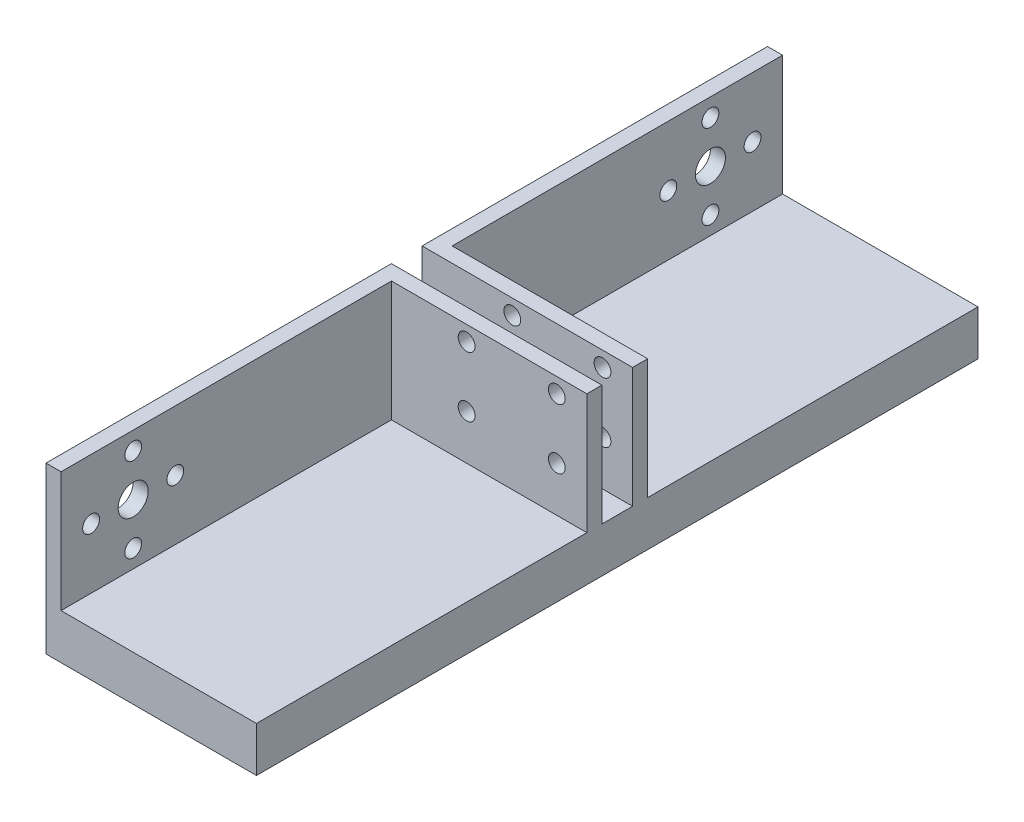
ISO-10303-21;
HEADER;
FILE_DESCRIPTION(('STEP AP214'),'2;1');
FILE_NAME('part.step','',(''),(''),'','','');
FILE_SCHEMA(('AUTOMOTIVE_DESIGN { 1 0 10303 214 1 1 1 1 }'));
ENDSEC;
DATA;
#1=APPLICATION_CONTEXT('core data for automotive mechanical design processes');
#2=APPLICATION_PROTOCOL_DEFINITION('international standard','automotive_design',2000,#1);
#3=PRODUCT_CONTEXT('',#1,'mechanical');
#4=PRODUCT('Part','Part','',(#3));
#5=PRODUCT_RELATED_PRODUCT_CATEGORY('part','',(#4));
#6=PRODUCT_DEFINITION_FORMATION('','',#4);
#7=PRODUCT_DEFINITION_CONTEXT('part definition',#1,'design');
#8=PRODUCT_DEFINITION('design','',#6,#7);
#9=PRODUCT_DEFINITION_SHAPE('','',#8);
#10=(LENGTH_UNIT() NAMED_UNIT(*) SI_UNIT(.MILLI.,.METRE.));
#11=(NAMED_UNIT(*) PLANE_ANGLE_UNIT() SI_UNIT($,.RADIAN.));
#12=(NAMED_UNIT(*) SI_UNIT($,.STERADIAN.) SOLID_ANGLE_UNIT());
#13=UNCERTAINTY_MEASURE_WITH_UNIT(LENGTH_MEASURE(1.E-05),#10,'distance_accuracy_value','');
#14=(GEOMETRIC_REPRESENTATION_CONTEXT(3) GLOBAL_UNCERTAINTY_ASSIGNED_CONTEXT((#13)) GLOBAL_UNIT_ASSIGNED_CONTEXT((#10,
#11,#12)) REPRESENTATION_CONTEXT('',''));
#15=CARTESIAN_POINT('',(0.,0.,0.));
#16=DIRECTION('',(0.,0.,1.));
#17=DIRECTION('',(1.,0.,0.));
#18=AXIS2_PLACEMENT_3D('',#15,#16,#17);
#19=CARTESIAN_POINT('',(0.,7.5,0.));
#20=DIRECTION('',(0.,1.,0.));
#21=DIRECTION('',(0.,0.,1.));
#22=AXIS2_PLACEMENT_3D('',#19,#20,#21);
#23=PLANE('',#22);
#24=DIRECTION('',(0.,0.,1.));
#25=VECTOR('',#24,1.);
#26=CARTESIAN_POINT('',(-32.5,7.5,0.));
#27=LINE('',#26,#25);
#28=CARTESIAN_POINT('',(-32.5,7.5,-60.));
#29=VERTEX_POINT('',#28);
#30=CARTESIAN_POINT('',(-32.5,7.5,-5.04999999999999));
#31=VERTEX_POINT('',#30);
#32=EDGE_CURVE('E179',#29,#31,#27,.T.);
#33=ORIENTED_EDGE('',*,*,#32,.T.);
#34=DIRECTION('',(1.,0.,0.));
#35=VECTOR('',#34,1.);
#36=CARTESIAN_POINT('',(0.,7.5,-5.05000000000001));
#37=LINE('',#36,#35);
#38=CARTESIAN_POINT('',(0.,7.5,-5.05));
#39=VERTEX_POINT('',#38);
#40=EDGE_CURVE('E58',#31,#39,#37,.T.);
#41=ORIENTED_EDGE('',*,*,#40,.T.);
#42=DIRECTION('',(0.,0.,-1.));
#43=VECTOR('',#42,1.);
#44=CARTESIAN_POINT('',(0.,7.5,-60.));
#45=LINE('',#44,#43);
#46=CARTESIAN_POINT('',(0.,7.5,-60.));
#47=VERTEX_POINT('',#46);
#48=EDGE_CURVE('E228',#39,#47,#45,.T.);
#49=ORIENTED_EDGE('',*,*,#48,.T.);
#50=DIRECTION('',(-1.,0.,0.));
#51=VECTOR('',#50,1.);
#52=CARTESIAN_POINT('',(-35.,7.5,-60.));
#53=LINE('',#52,#51);
#54=EDGE_CURVE('E232',#47,#29,#53,.T.);
#55=ORIENTED_EDGE('',*,*,#54,.T.);
#56=EDGE_LOOP('',(#33,#41,#49,#55));
#57=FACE_BOUND('',#56,.T.);
#58=ADVANCED_FACE('F41',(#57),#23,.T.);
#59=CARTESIAN_POINT('',(0.,7.5,60.));
#60=VERTEX_POINT('',#59);
#61=CARTESIAN_POINT('',(0.,7.5,5.05000000000001));
#62=VERTEX_POINT('',#61);
#63=EDGE_CURVE('E229',#60,#62,#45,.T.);
#64=ORIENTED_EDGE('',*,*,#63,.T.);
#65=DIRECTION('',(-1.,0.,0.));
#66=VECTOR('',#65,1.);
#67=CARTESIAN_POINT('',(0.,7.5,5.05000000000001));
#68=LINE('',#67,#66);
#69=CARTESIAN_POINT('',(-32.5,7.5,5.05));
#70=VERTEX_POINT('',#69);
#71=EDGE_CURVE('E194',#62,#70,#68,.T.);
#72=ORIENTED_EDGE('',*,*,#71,.T.);
#73=DIRECTION('',(0.,0.,1.));
#74=VECTOR('',#73,1.);
#75=CARTESIAN_POINT('',(-32.5,7.5,0.));
#76=LINE('',#75,#74);
#77=CARTESIAN_POINT('',(-32.5,7.5,60.));
#78=VERTEX_POINT('',#77);
#79=EDGE_CURVE('E210',#70,#78,#76,.T.);
#80=ORIENTED_EDGE('',*,*,#79,.T.);
#81=DIRECTION('',(1.,0.,0.));
#82=VECTOR('',#81,1.);
#83=CARTESIAN_POINT('',(-35.,7.5,60.));
#84=LINE('',#83,#82);
#85=EDGE_CURVE('E225',#78,#60,#84,.T.);
#86=ORIENTED_EDGE('',*,*,#85,.T.);
#87=EDGE_LOOP('',(#64,#72,#80,#86));
#88=FACE_BOUND('',#87,.T.);
#89=ADVANCED_FACE('F312',(#88),#23,.T.);
#90=CARTESIAN_POINT('',(-35.,7.5,-60.));
#91=DIRECTION('',(1.,0.,0.));
#92=DIRECTION('',(0.,0.,-1.));
#93=AXIS2_PLACEMENT_3D('',#90,#91,#92);
#94=PLANE('',#93);
#95=CARTESIAN_POINT('',(-35.,17.5,41.));
#96=DIRECTION('',(1.,0.,0.));
#97=DIRECTION('',(0.,0.,1.));
#98=AXIS2_PLACEMENT_3D('',#95,#96,#97);
#99=CIRCLE('',#98,1.4);
#100=CARTESIAN_POINT('',(-35.,17.5,42.4));
#101=VERTEX_POINT('',#100);
#102=EDGE_CURVE('E451',#101,#101,#99,.T.);
#103=ORIENTED_EDGE('',*,*,#102,.T.);
#104=EDGE_LOOP('',(#103));
#105=FACE_BOUND('',#104,.T.);
#106=CARTESIAN_POINT('',(-35.,10.5,48.));
#107=DIRECTION('',(1.,0.,0.));
#108=DIRECTION('',(0.,0.,1.));
#109=AXIS2_PLACEMENT_3D('',#106,#107,#108);
#110=CIRCLE('',#109,1.4);
#111=CARTESIAN_POINT('',(-35.,10.5,49.4));
#112=VERTEX_POINT('',#111);
#113=EDGE_CURVE('E481',#112,#112,#110,.T.);
#114=ORIENTED_EDGE('',*,*,#113,.T.);
#115=EDGE_LOOP('',(#114));
#116=FACE_BOUND('',#115,.T.);
#117=CARTESIAN_POINT('',(-35.,17.5,55.));
#118=DIRECTION('',(1.,0.,0.));
#119=DIRECTION('',(0.,0.,-1.));
#120=AXIS2_PLACEMENT_3D('',#117,#118,#119);
#121=CIRCLE('',#120,1.4);
#122=CARTESIAN_POINT('',(-35.,17.5,53.6));
#123=VERTEX_POINT('',#122);
#124=EDGE_CURVE('E464',#123,#123,#121,.T.);
#125=ORIENTED_EDGE('',*,*,#124,.T.);
#126=EDGE_LOOP('',(#125));
#127=FACE_BOUND('',#126,.T.);
#128=CARTESIAN_POINT('',(-35.,24.5,48.));
#129=DIRECTION('',(1.,0.,0.));
#130=DIRECTION('',(0.,0.,-1.));
#131=AXIS2_PLACEMENT_3D('',#128,#129,#130);
#132=CIRCLE('',#131,1.4);
#133=CARTESIAN_POINT('',(-35.,24.5,46.6));
#134=VERTEX_POINT('',#133);
#135=EDGE_CURVE('E471',#134,#134,#132,.T.);
#136=ORIENTED_EDGE('',*,*,#135,.T.);
#137=EDGE_LOOP('',(#136));
#138=FACE_BOUND('',#137,.T.);
#139=CARTESIAN_POINT('',(-35.,24.5,-48.));
#140=DIRECTION('',(1.,0.,0.));
#141=DIRECTION('',(0.,0.,1.));
#142=AXIS2_PLACEMENT_3D('',#139,#140,#141);
#143=CIRCLE('',#142,1.4);
#144=CARTESIAN_POINT('',(-35.,24.5,-46.6));
#145=VERTEX_POINT('',#144);
#146=EDGE_CURVE('E452',#145,#145,#143,.T.);
#147=ORIENTED_EDGE('',*,*,#146,.T.);
#148=EDGE_LOOP('',(#147));
#149=FACE_BOUND('',#148,.T.);
#150=CARTESIAN_POINT('',(-35.,17.5,-55.));
#151=DIRECTION('',(1.,0.,0.));
#152=DIRECTION('',(0.,0.,1.));
#153=AXIS2_PLACEMENT_3D('',#150,#151,#152);
#154=CIRCLE('',#153,1.4);
#155=CARTESIAN_POINT('',(-35.,17.5,-53.6));
#156=VERTEX_POINT('',#155);
#157=EDGE_CURVE('E459',#156,#156,#154,.T.);
#158=ORIENTED_EDGE('',*,*,#157,.T.);
#159=EDGE_LOOP('',(#158));
#160=FACE_BOUND('',#159,.T.);
#161=CARTESIAN_POINT('',(-35.,10.5,-48.));
#162=DIRECTION('',(1.,0.,0.));
#163=DIRECTION('',(0.,0.,-1.));
#164=AXIS2_PLACEMENT_3D('',#161,#162,#163);
#165=CIRCLE('',#164,1.4);
#166=CARTESIAN_POINT('',(-35.,10.5,-49.4));
#167=VERTEX_POINT('',#166);
#168=EDGE_CURVE('E438',#167,#167,#165,.T.);
#169=ORIENTED_EDGE('',*,*,#168,.T.);
#170=EDGE_LOOP('',(#169));
#171=FACE_BOUND('',#170,.T.);
#172=CARTESIAN_POINT('',(-35.,17.5,-41.));
#173=DIRECTION('',(1.,0.,0.));
#174=DIRECTION('',(0.,0.,-1.));
#175=AXIS2_PLACEMENT_3D('',#172,#173,#174);
#176=CIRCLE('',#175,1.4);
#177=CARTESIAN_POINT('',(-35.,17.5,-42.4));
#178=VERTEX_POINT('',#177);
#179=EDGE_CURVE('E445',#178,#178,#176,.T.);
#180=ORIENTED_EDGE('',*,*,#179,.T.);
#181=EDGE_LOOP('',(#180));
#182=FACE_BOUND('',#181,.T.);
#183=CARTESIAN_POINT('',(-35.,17.5,-48.));
#184=DIRECTION('',(1.,0.,0.));
#185=DIRECTION('',(0.,0.,1.));
#186=AXIS2_PLACEMENT_3D('',#183,#184,#185);
#187=CIRCLE('',#186,2.5);
#188=CARTESIAN_POINT('',(-35.,17.5,-45.5));
#189=VERTEX_POINT('',#188);
#190=EDGE_CURVE('E486',#189,#189,#187,.T.);
#191=ORIENTED_EDGE('',*,*,#190,.T.);
#192=EDGE_LOOP('',(#191));
#193=FACE_BOUND('',#192,.T.);
#194=CARTESIAN_POINT('',(-35.,17.5,48.));
#195=DIRECTION('',(1.,0.,0.));
#196=DIRECTION('',(0.,0.,-1.));
#197=AXIS2_PLACEMENT_3D('',#194,#195,#196);
#198=CIRCLE('',#197,2.5);
#199=CARTESIAN_POINT('',(-35.,17.5,45.5));
#200=VERTEX_POINT('',#199);
#201=EDGE_CURVE('E431',#200,#200,#198,.T.);
#202=ORIENTED_EDGE('',*,*,#201,.T.);
#203=EDGE_LOOP('',(#202));
#204=FACE_BOUND('',#203,.T.);
#205=DIRECTION('',(0.,0.,1.));
#206=VECTOR('',#205,1.);
#207=CARTESIAN_POINT('',(-35.,0.,-60.));
#208=LINE('',#207,#206);
#209=CARTESIAN_POINT('',(-35.,0.,-60.));
#210=VERTEX_POINT('',#209);
#211=CARTESIAN_POINT('',(-35.,0.,60.));
#212=VERTEX_POINT('',#211);
#213=EDGE_CURVE('E152',#210,#212,#208,.T.);
#214=ORIENTED_EDGE('',*,*,#213,.T.);
#215=DIRECTION('',(0.,-1.,0.));
#216=VECTOR('',#215,1.);
#217=CARTESIAN_POINT('',(-35.,7.5,60.));
#218=LINE('',#217,#216);
#219=CARTESIAN_POINT('',(-35.,27.5,60.));
#220=VERTEX_POINT('',#219);
#221=EDGE_CURVE('E11',#220,#212,#218,.T.);
#222=ORIENTED_EDGE('',*,*,#221,.F.);
#223=DIRECTION('',(0.,0.,1.));
#224=VECTOR('',#223,1.);
#225=CARTESIAN_POINT('',(-35.,27.5,0.));
#226=LINE('',#225,#224);
#227=CARTESIAN_POINT('',(-35.,27.5,2.55));
#228=VERTEX_POINT('',#227);
#229=EDGE_CURVE('E193',#228,#220,#226,.T.);
#230=ORIENTED_EDGE('',*,*,#229,.F.);
#231=DIRECTION('',(0.,-1.,0.));
#232=VECTOR('',#231,1.);
#233=CARTESIAN_POINT('',(-35.,27.5,2.55));
#234=LINE('',#233,#232);
#235=CARTESIAN_POINT('',(-35.,7.5,2.55));
#236=VERTEX_POINT('',#235);
#237=EDGE_CURVE('E180',#228,#236,#234,.T.);
#238=ORIENTED_EDGE('',*,*,#237,.T.);
#239=DIRECTION('',(0.,0.,1.));
#240=VECTOR('',#239,1.);
#241=CARTESIAN_POINT('',(-35.,7.5,-60.));
#242=LINE('',#241,#240);
#243=CARTESIAN_POINT('',(-35.,7.5,-2.55));
#244=VERTEX_POINT('',#243);
#245=EDGE_CURVE('E222',#244,#236,#242,.T.);
#246=ORIENTED_EDGE('',*,*,#245,.F.);
#247=DIRECTION('',(0.,-1.,0.));
#248=VECTOR('',#247,1.);
#249=CARTESIAN_POINT('',(-35.,27.5,-2.55));
#250=LINE('',#249,#248);
#251=CARTESIAN_POINT('',(-35.,27.5,-2.55));
#252=VERTEX_POINT('',#251);
#253=EDGE_CURVE('E187',#252,#244,#250,.T.);
#254=ORIENTED_EDGE('',*,*,#253,.F.);
#255=DIRECTION('',(0.,0.,1.));
#256=VECTOR('',#255,1.);
#257=CARTESIAN_POINT('',(-35.,27.5,0.));
#258=LINE('',#257,#256);
#259=CARTESIAN_POINT('',(-35.,27.5,-60.));
#260=VERTEX_POINT('',#259);
#261=EDGE_CURVE('E169',#260,#252,#258,.T.);
#262=ORIENTED_EDGE('',*,*,#261,.F.);
#263=DIRECTION('',(0.,-1.,0.));
#264=VECTOR('',#263,1.);
#265=CARTESIAN_POINT('',(-35.,7.5,-60.));
#266=LINE('',#265,#264);
#267=EDGE_CURVE('E236',#260,#210,#266,.T.);
#268=ORIENTED_EDGE('',*,*,#267,.T.);
#269=EDGE_LOOP('',(#214,#222,#230,#238,#246,#254,#262,#268));
#270=FACE_BOUND('',#269,.T.);
#271=ADVANCED_FACE('F43',(#105,#116,#127,#138,#149,#160,#171,#182,#193,#204,#270),#94,.F.);
#272=CARTESIAN_POINT('',(-35.,7.5,60.));
#273=DIRECTION('',(0.,0.,-1.));
#274=DIRECTION('',(-1.,0.,0.));
#275=AXIS2_PLACEMENT_3D('',#272,#273,#274);
#276=PLANE('',#275);
#277=DIRECTION('',(1.,0.,0.));
#278=VECTOR('',#277,1.);
#279=CARTESIAN_POINT('',(-35.,0.,60.));
#280=LINE('',#279,#278);
#281=CARTESIAN_POINT('',(0.,0.,60.));
#282=VERTEX_POINT('',#281);
#283=EDGE_CURVE('E239',#212,#282,#280,.T.);
#284=ORIENTED_EDGE('',*,*,#283,.T.);
#285=DIRECTION('',(0.,-1.,0.));
#286=VECTOR('',#285,1.);
#287=CARTESIAN_POINT('',(0.,7.5,60.));
#288=LINE('',#287,#286);
#289=EDGE_CURVE('E50',#60,#282,#288,.T.);
#290=ORIENTED_EDGE('',*,*,#289,.F.);
#291=ORIENTED_EDGE('',*,*,#85,.F.);
#292=DIRECTION('',(0.,-1.,0.));
#293=VECTOR('',#292,1.);
#294=CARTESIAN_POINT('',(-32.5,27.5,60.));
#295=LINE('',#294,#293);
#296=CARTESIAN_POINT('',(-32.5,27.5,60.));
#297=VERTEX_POINT('',#296);
#298=EDGE_CURVE('E66',#297,#78,#295,.T.);
#299=ORIENTED_EDGE('',*,*,#298,.F.);
#300=DIRECTION('',(1.,0.,0.));
#301=VECTOR('',#300,1.);
#302=CARTESIAN_POINT('',(0.,27.5,60.));
#303=LINE('',#302,#301);
#304=EDGE_CURVE('E197',#220,#297,#303,.T.);
#305=ORIENTED_EDGE('',*,*,#304,.F.);
#306=ORIENTED_EDGE('',*,*,#221,.T.);
#307=EDGE_LOOP('',(#284,#290,#291,#299,#305,#306));
#308=FACE_BOUND('',#307,.T.);
#309=ADVANCED_FACE('F361',(#308),#276,.F.);
#310=CARTESIAN_POINT('',(0.,7.5,-60.));
#311=DIRECTION('',(-1.,0.,0.));
#312=DIRECTION('',(0.,0.,1.));
#313=AXIS2_PLACEMENT_3D('',#310,#311,#312);
#314=PLANE('',#313);
#315=DIRECTION('',(0.,0.,-1.));
#316=VECTOR('',#315,1.);
#317=CARTESIAN_POINT('',(0.,0.,-60.));
#318=LINE('',#317,#316);
#319=CARTESIAN_POINT('',(0.,0.,-60.));
#320=VERTEX_POINT('',#319);
#321=EDGE_CURVE('E241',#282,#320,#318,.T.);
#322=ORIENTED_EDGE('',*,*,#321,.T.);
#323=DIRECTION('',(0.,-1.,0.));
#324=VECTOR('',#323,1.);
#325=CARTESIAN_POINT('',(0.,7.5,-60.));
#326=LINE('',#325,#324);
#327=EDGE_CURVE('E246',#47,#320,#326,.T.);
#328=ORIENTED_EDGE('',*,*,#327,.F.);
#329=ORIENTED_EDGE('',*,*,#48,.F.);
#330=DIRECTION('',(0.,-1.,0.));
#331=VECTOR('',#330,1.);
#332=CARTESIAN_POINT('',(0.,27.5,-5.05));
#333=LINE('',#332,#331);
#334=CARTESIAN_POINT('',(0.,27.5,-5.05));
#335=VERTEX_POINT('',#334);
#336=EDGE_CURVE('E177',#335,#39,#333,.T.);
#337=ORIENTED_EDGE('',*,*,#336,.F.);
#338=DIRECTION('',(0.,0.,-1.));
#339=VECTOR('',#338,1.);
#340=CARTESIAN_POINT('',(0.,27.5,0.));
#341=LINE('',#340,#339);
#342=CARTESIAN_POINT('',(0.,27.5,-2.55));
#343=VERTEX_POINT('',#342);
#344=EDGE_CURVE('E161',#343,#335,#341,.T.);
#345=ORIENTED_EDGE('',*,*,#344,.F.);
#346=DIRECTION('',(0.,-1.,0.));
#347=VECTOR('',#346,1.);
#348=CARTESIAN_POINT('',(0.,27.5,-2.55));
#349=LINE('',#348,#347);
#350=CARTESIAN_POINT('',(0.,7.5,-2.55));
#351=VERTEX_POINT('',#350);
#352=EDGE_CURVE('E184',#343,#351,#349,.T.);
#353=ORIENTED_EDGE('',*,*,#352,.T.);
#354=CARTESIAN_POINT('',(0.,7.5,2.55));
#355=VERTEX_POINT('',#354);
#356=EDGE_CURVE('E233',#355,#351,#45,.T.);
#357=ORIENTED_EDGE('',*,*,#356,.F.);
#358=DIRECTION('',(0.,-1.,0.));
#359=VECTOR('',#358,1.);
#360=CARTESIAN_POINT('',(0.,27.5,2.55));
#361=LINE('',#360,#359);
#362=CARTESIAN_POINT('',(0.,27.5,2.55));
#363=VERTEX_POINT('',#362);
#364=EDGE_CURVE('E206',#363,#355,#361,.T.);
#365=ORIENTED_EDGE('',*,*,#364,.F.);
#366=DIRECTION('',(0.,0.,-1.));
#367=VECTOR('',#366,1.);
#368=CARTESIAN_POINT('',(0.,27.5,0.));
#369=LINE('',#368,#367);
#370=CARTESIAN_POINT('',(0.,27.5,5.05000000000001));
#371=VERTEX_POINT('',#370);
#372=EDGE_CURVE('E204',#371,#363,#369,.T.);
#373=ORIENTED_EDGE('',*,*,#372,.F.);
#374=DIRECTION('',(0.,-1.,0.));
#375=VECTOR('',#374,1.);
#376=CARTESIAN_POINT('',(0.,27.5,5.05000000000001));
#377=LINE('',#376,#375);
#378=EDGE_CURVE('E216',#371,#62,#377,.T.);
#379=ORIENTED_EDGE('',*,*,#378,.T.);
#380=ORIENTED_EDGE('',*,*,#63,.F.);
#381=ORIENTED_EDGE('',*,*,#289,.T.);
#382=EDGE_LOOP('',(#322,#328,#329,#337,#345,#353,#357,#365,#373,#379,#380,#381));
#383=FACE_BOUND('',#382,.T.);
#384=ADVANCED_FACE('F332',(#383),#314,.F.);
#385=CARTESIAN_POINT('',(-35.,7.5,-60.));
#386=DIRECTION('',(0.,0.,1.));
#387=DIRECTION('',(1.,0.,0.));
#388=AXIS2_PLACEMENT_3D('',#385,#386,#387);
#389=PLANE('',#388);
#390=DIRECTION('',(-1.,0.,0.));
#391=VECTOR('',#390,1.);
#392=CARTESIAN_POINT('',(-35.,0.,-60.));
#393=LINE('',#392,#391);
#394=EDGE_CURVE('E226',#320,#210,#393,.T.);
#395=ORIENTED_EDGE('',*,*,#394,.T.);
#396=ORIENTED_EDGE('',*,*,#267,.F.);
#397=DIRECTION('',(-1.,0.,0.));
#398=VECTOR('',#397,1.);
#399=CARTESIAN_POINT('',(0.,27.5,-60.));
#400=LINE('',#399,#398);
#401=CARTESIAN_POINT('',(-32.5,27.5,-60.));
#402=VERTEX_POINT('',#401);
#403=EDGE_CURVE('E167',#402,#260,#400,.T.);
#404=ORIENTED_EDGE('',*,*,#403,.F.);
#405=DIRECTION('',(0.,-1.,0.));
#406=VECTOR('',#405,1.);
#407=CARTESIAN_POINT('',(-32.5,27.5,-60.));
#408=LINE('',#407,#406);
#409=EDGE_CURVE('E153',#402,#29,#408,.T.);
#410=ORIENTED_EDGE('',*,*,#409,.T.);
#411=ORIENTED_EDGE('',*,*,#54,.F.);
#412=ORIENTED_EDGE('',*,*,#327,.T.);
#413=EDGE_LOOP('',(#395,#396,#404,#410,#411,#412));
#414=FACE_BOUND('',#413,.T.);
#415=ADVANCED_FACE('F325',(#414),#389,.F.);
#416=DIRECTION('',(1.,0.,0.));
#417=VECTOR('',#416,1.);
#418=CARTESIAN_POINT('',(0.,7.5,-2.55000000000001));
#419=LINE('',#418,#417);
#420=EDGE_CURVE('E163',#244,#351,#419,.T.);
#421=ORIENTED_EDGE('',*,*,#420,.F.);
#422=ORIENTED_EDGE('',*,*,#245,.T.);
#423=DIRECTION('',(-1.,0.,0.));
#424=VECTOR('',#423,1.);
#425=CARTESIAN_POINT('',(0.,7.5,2.55000000000001));
#426=LINE('',#425,#424);
#427=EDGE_CURVE('E207',#355,#236,#426,.T.);
#428=ORIENTED_EDGE('',*,*,#427,.F.);
#429=ORIENTED_EDGE('',*,*,#356,.T.);
#430=EDGE_LOOP('',(#421,#422,#428,#429));
#431=FACE_BOUND('',#430,.T.);
#432=ADVANCED_FACE('F315',(#431),#23,.T.);
#433=CARTESIAN_POINT('',(0.,0.,0.));
#434=DIRECTION('',(0.,1.,0.));
#435=DIRECTION('',(0.,0.,1.));
#436=AXIS2_PLACEMENT_3D('',#433,#434,#435);
#437=PLANE('',#436);
#438=ORIENTED_EDGE('',*,*,#213,.F.);
#439=ORIENTED_EDGE('',*,*,#394,.F.);
#440=ORIENTED_EDGE('',*,*,#321,.F.);
#441=ORIENTED_EDGE('',*,*,#283,.F.);
#442=EDGE_LOOP('',(#438,#439,#440,#441));
#443=FACE_BOUND('',#442,.T.);
#444=ADVANCED_FACE('F324',(#443),#437,.F.);
#445=CARTESIAN_POINT('',(0.,27.5,2.55000000000001));
#446=DIRECTION('',(0.,0.,1.));
#447=DIRECTION('',(1.,0.,0.));
#448=AXIS2_PLACEMENT_3D('',#445,#446,#447);
#449=PLANE('',#448);
#450=CARTESIAN_POINT('',(-20.,25.,2.55));
#451=DIRECTION('',(0.,0.,1.));
#452=DIRECTION('',(1.,0.,0.));
#453=AXIS2_PLACEMENT_3D('',#450,#451,#452);
#454=CIRCLE('',#453,1.4);
#455=CARTESIAN_POINT('',(-18.6,25.,2.55));
#456=VERTEX_POINT('',#455);
#457=EDGE_CURVE('E211',#456,#456,#454,.T.);
#458=ORIENTED_EDGE('',*,*,#457,.T.);
#459=EDGE_LOOP('',(#458));
#460=FACE_BOUND('',#459,.T.);
#461=CARTESIAN_POINT('',(-5.00000000000001,15.,2.55000000000001));
#462=DIRECTION('',(0.,0.,1.));
#463=DIRECTION('',(1.,0.,0.));
#464=AXIS2_PLACEMENT_3D('',#461,#462,#463);
#465=CIRCLE('',#464,1.4);
#466=CARTESIAN_POINT('',(-3.60000000000001,15.,2.55000000000001));
#467=VERTEX_POINT('',#466);
#468=EDGE_CURVE('E267',#467,#467,#465,.T.);
#469=ORIENTED_EDGE('',*,*,#468,.T.);
#470=EDGE_LOOP('',(#469));
#471=FACE_BOUND('',#470,.T.);
#472=CARTESIAN_POINT('',(-20.,15.,2.55));
#473=DIRECTION('',(0.,0.,1.));
#474=DIRECTION('',(1.,0.,0.));
#475=AXIS2_PLACEMENT_3D('',#472,#473,#474);
#476=CIRCLE('',#475,1.4);
#477=CARTESIAN_POINT('',(-18.6,15.,2.55));
#478=VERTEX_POINT('',#477);
#479=EDGE_CURVE('E263',#478,#478,#476,.T.);
#480=ORIENTED_EDGE('',*,*,#479,.T.);
#481=EDGE_LOOP('',(#480));
#482=FACE_BOUND('',#481,.T.);
#483=CARTESIAN_POINT('',(-5.00000000000001,25.,2.55000000000001));
#484=DIRECTION('',(0.,0.,1.));
#485=DIRECTION('',(1.,0.,0.));
#486=AXIS2_PLACEMENT_3D('',#483,#484,#485);
#487=CIRCLE('',#486,1.4);
#488=CARTESIAN_POINT('',(-3.60000000000001,25.,2.55000000000001));
#489=VERTEX_POINT('',#488);
#490=EDGE_CURVE('E259',#489,#489,#487,.T.);
#491=ORIENTED_EDGE('',*,*,#490,.T.);
#492=EDGE_LOOP('',(#491));
#493=FACE_BOUND('',#492,.T.);
#494=ORIENTED_EDGE('',*,*,#427,.T.);
#495=ORIENTED_EDGE('',*,*,#237,.F.);
#496=DIRECTION('',(-1.,0.,0.));
#497=VECTOR('',#496,1.);
#498=CARTESIAN_POINT('',(0.,27.5,2.55000000000001));
#499=LINE('',#498,#497);
#500=EDGE_CURVE('E190',#363,#228,#499,.T.);
#501=ORIENTED_EDGE('',*,*,#500,.F.);
#502=ORIENTED_EDGE('',*,*,#364,.T.);
#503=EDGE_LOOP('',(#494,#495,#501,#502));
#504=FACE_BOUND('',#503,.T.);
#505=ADVANCED_FACE('F284',(#460,#471,#482,#493,#504),#449,.F.);
#506=CARTESIAN_POINT('',(-32.5,27.5,0.));
#507=DIRECTION('',(1.,0.,0.));
#508=DIRECTION('',(0.,0.,-1.));
#509=AXIS2_PLACEMENT_3D('',#506,#507,#508);
#510=PLANE('',#509);
#511=CARTESIAN_POINT('',(-32.5,17.5,41.));
#512=DIRECTION('',(1.,0.,0.));
#513=DIRECTION('',(0.,0.,1.));
#514=AXIS2_PLACEMENT_3D('',#511,#512,#513);
#515=CIRCLE('',#514,1.4);
#516=CARTESIAN_POINT('',(-32.5,17.5,42.4));
#517=VERTEX_POINT('',#516);
#518=EDGE_CURVE('E478',#517,#517,#515,.T.);
#519=ORIENTED_EDGE('',*,*,#518,.F.);
#520=EDGE_LOOP('',(#519));
#521=FACE_BOUND('',#520,.T.);
#522=CARTESIAN_POINT('',(-32.5,10.5,48.));
#523=DIRECTION('',(1.,0.,0.));
#524=DIRECTION('',(0.,0.,1.));
#525=AXIS2_PLACEMENT_3D('',#522,#523,#524);
#526=CIRCLE('',#525,1.4);
#527=CARTESIAN_POINT('',(-32.5,10.5,49.4));
#528=VERTEX_POINT('',#527);
#529=EDGE_CURVE('E468',#528,#528,#526,.T.);
#530=ORIENTED_EDGE('',*,*,#529,.F.);
#531=EDGE_LOOP('',(#530));
#532=FACE_BOUND('',#531,.T.);
#533=CARTESIAN_POINT('',(-32.5,17.5,55.));
#534=DIRECTION('',(1.,0.,0.));
#535=DIRECTION('',(0.,0.,-1.));
#536=AXIS2_PLACEMENT_3D('',#533,#534,#535);
#537=CIRCLE('',#536,1.4);
#538=CARTESIAN_POINT('',(-32.5,17.5,53.6));
#539=VERTEX_POINT('',#538);
#540=EDGE_CURVE('E467',#539,#539,#537,.T.);
#541=ORIENTED_EDGE('',*,*,#540,.F.);
#542=EDGE_LOOP('',(#541));
#543=FACE_BOUND('',#542,.T.);
#544=CARTESIAN_POINT('',(-32.5,24.5,48.));
#545=DIRECTION('',(1.,0.,0.));
#546=DIRECTION('',(0.,0.,-1.));
#547=AXIS2_PLACEMENT_3D('',#544,#545,#546);
#548=CIRCLE('',#547,1.4);
#549=CARTESIAN_POINT('',(-32.5,24.5,46.6));
#550=VERTEX_POINT('',#549);
#551=EDGE_CURVE('E435',#550,#550,#548,.T.);
#552=ORIENTED_EDGE('',*,*,#551,.F.);
#553=EDGE_LOOP('',(#552));
#554=FACE_BOUND('',#553,.T.);
#555=CARTESIAN_POINT('',(-32.5,17.5,48.));
#556=DIRECTION('',(1.,0.,0.));
#557=DIRECTION('',(0.,0.,-1.));
#558=AXIS2_PLACEMENT_3D('',#555,#556,#557);
#559=CIRCLE('',#558,2.5);
#560=CARTESIAN_POINT('',(-32.5,17.5,45.5));
#561=VERTEX_POINT('',#560);
#562=EDGE_CURVE('E432',#561,#561,#559,.T.);
#563=ORIENTED_EDGE('',*,*,#562,.F.);
#564=EDGE_LOOP('',(#563));
#565=FACE_BOUND('',#564,.T.);
#566=ORIENTED_EDGE('',*,*,#79,.F.);
#567=DIRECTION('',(0.,-1.,0.));
#568=VECTOR('',#567,1.);
#569=CARTESIAN_POINT('',(-32.5,27.5,5.05));
#570=LINE('',#569,#568);
#571=CARTESIAN_POINT('',(-32.5,27.5,5.05));
#572=VERTEX_POINT('',#571);
#573=EDGE_CURVE('E218',#572,#70,#570,.T.);
#574=ORIENTED_EDGE('',*,*,#573,.F.);
#575=DIRECTION('',(0.,0.,1.));
#576=VECTOR('',#575,1.);
#577=CARTESIAN_POINT('',(-32.5,27.5,0.));
#578=LINE('',#577,#576);
#579=EDGE_CURVE('E199',#572,#297,#578,.T.);
#580=ORIENTED_EDGE('',*,*,#579,.T.);
#581=ORIENTED_EDGE('',*,*,#298,.T.);
#582=EDGE_LOOP('',(#566,#574,#580,#581));
#583=FACE_BOUND('',#582,.T.);
#584=ADVANCED_FACE('F371',(#521,#532,#543,#554,#565,#583),#510,.T.);
#585=CARTESIAN_POINT('',(0.,27.5,5.05000000000001));
#586=DIRECTION('',(0.,0.,1.));
#587=DIRECTION('',(1.,0.,0.));
#588=AXIS2_PLACEMENT_3D('',#585,#586,#587);
#589=PLANE('',#588);
#590=CARTESIAN_POINT('',(-20.,25.,5.05000000000001));
#591=DIRECTION('',(0.,0.,1.));
#592=DIRECTION('',(1.,0.,0.));
#593=AXIS2_PLACEMENT_3D('',#590,#591,#592);
#594=CIRCLE('',#593,1.4);
#595=CARTESIAN_POINT('',(-18.6,25.,5.05000000000001));
#596=VERTEX_POINT('',#595);
#597=EDGE_CURVE('E423',#596,#596,#594,.T.);
#598=ORIENTED_EDGE('',*,*,#597,.F.);
#599=EDGE_LOOP('',(#598));
#600=FACE_BOUND('',#599,.T.);
#601=CARTESIAN_POINT('',(-5.00000000000001,15.,5.05000000000001));
#602=DIRECTION('',(0.,0.,1.));
#603=DIRECTION('',(1.,0.,0.));
#604=AXIS2_PLACEMENT_3D('',#601,#602,#603);
#605=CIRCLE('',#604,1.4);
#606=CARTESIAN_POINT('',(-3.60000000000001,15.,5.05000000000001));
#607=VERTEX_POINT('',#606);
#608=EDGE_CURVE('E424',#607,#607,#605,.T.);
#609=ORIENTED_EDGE('',*,*,#608,.F.);
#610=EDGE_LOOP('',(#609));
#611=FACE_BOUND('',#610,.T.);
#612=CARTESIAN_POINT('',(-20.,15.,5.05000000000001));
#613=DIRECTION('',(0.,0.,1.));
#614=DIRECTION('',(1.,0.,0.));
#615=AXIS2_PLACEMENT_3D('',#612,#613,#614);
#616=CIRCLE('',#615,1.4);
#617=CARTESIAN_POINT('',(-18.6,15.,5.05000000000001));
#618=VERTEX_POINT('',#617);
#619=EDGE_CURVE('E427',#618,#618,#616,.T.);
#620=ORIENTED_EDGE('',*,*,#619,.F.);
#621=EDGE_LOOP('',(#620));
#622=FACE_BOUND('',#621,.T.);
#623=CARTESIAN_POINT('',(-5.00000000000001,25.,5.05000000000001));
#624=DIRECTION('',(0.,0.,1.));
#625=DIRECTION('',(1.,0.,0.));
#626=AXIS2_PLACEMENT_3D('',#623,#624,#625);
#627=CIRCLE('',#626,1.4);
#628=CARTESIAN_POINT('',(-3.60000000000001,25.,5.05000000000001));
#629=VERTEX_POINT('',#628);
#630=EDGE_CURVE('E255',#629,#629,#627,.T.);
#631=ORIENTED_EDGE('',*,*,#630,.F.);
#632=EDGE_LOOP('',(#631));
#633=FACE_BOUND('',#632,.T.);
#634=ORIENTED_EDGE('',*,*,#71,.F.);
#635=ORIENTED_EDGE('',*,*,#378,.F.);
#636=DIRECTION('',(-1.,0.,0.));
#637=VECTOR('',#636,1.);
#638=CARTESIAN_POINT('',(0.,27.5,5.05000000000001));
#639=LINE('',#638,#637);
#640=EDGE_CURVE('E201',#371,#572,#639,.T.);
#641=ORIENTED_EDGE('',*,*,#640,.T.);
#642=ORIENTED_EDGE('',*,*,#573,.T.);
#643=EDGE_LOOP('',(#634,#635,#641,#642));
#644=FACE_BOUND('',#643,.T.);
#645=ADVANCED_FACE('F369',(#600,#611,#622,#633,#644),#589,.T.);
#646=CARTESIAN_POINT('',(0.,27.5,0.));
#647=DIRECTION('',(0.,1.,0.));
#648=DIRECTION('',(0.,0.,1.));
#649=AXIS2_PLACEMENT_3D('',#646,#647,#648);
#650=PLANE('',#649);
#651=ORIENTED_EDGE('',*,*,#500,.T.);
#652=ORIENTED_EDGE('',*,*,#229,.T.);
#653=ORIENTED_EDGE('',*,*,#304,.T.);
#654=ORIENTED_EDGE('',*,*,#579,.F.);
#655=ORIENTED_EDGE('',*,*,#640,.F.);
#656=ORIENTED_EDGE('',*,*,#372,.T.);
#657=EDGE_LOOP('',(#651,#652,#653,#654,#655,#656));
#658=FACE_BOUND('',#657,.T.);
#659=ADVANCED_FACE('F363',(#658),#650,.T.);
#660=CARTESIAN_POINT('',(0.,27.5,-5.05000000000001));
#661=DIRECTION('',(0.,0.,-1.));
#662=DIRECTION('',(-1.,0.,0.));
#663=AXIS2_PLACEMENT_3D('',#660,#661,#662);
#664=PLANE('',#663);
#665=CARTESIAN_POINT('',(-20.,25.,-5.05));
#666=DIRECTION('',(0.,0.,-1.));
#667=DIRECTION('',(-1.,0.,0.));
#668=AXIS2_PLACEMENT_3D('',#665,#666,#667);
#669=CIRCLE('',#668,1.4);
#670=CARTESIAN_POINT('',(-21.4,25.,-5.05));
#671=VERTEX_POINT('',#670);
#672=EDGE_CURVE('E279',#671,#671,#669,.T.);
#673=ORIENTED_EDGE('',*,*,#672,.F.);
#674=EDGE_LOOP('',(#673));
#675=FACE_BOUND('',#674,.T.);
#676=CARTESIAN_POINT('',(-5.00000000000001,15.,-5.05000000000001));
#677=DIRECTION('',(0.,0.,-1.));
#678=DIRECTION('',(-1.,0.,0.));
#679=AXIS2_PLACEMENT_3D('',#676,#677,#678);
#680=CIRCLE('',#679,1.4);
#681=CARTESIAN_POINT('',(-6.40000000000001,15.,-5.05000000000001));
#682=VERTEX_POINT('',#681);
#683=EDGE_CURVE('E262',#682,#682,#680,.T.);
#684=ORIENTED_EDGE('',*,*,#683,.F.);
#685=EDGE_LOOP('',(#684));
#686=FACE_BOUND('',#685,.T.);
#687=CARTESIAN_POINT('',(-20.,15.,-5.05));
#688=DIRECTION('',(0.,0.,-1.));
#689=DIRECTION('',(-1.,0.,0.));
#690=AXIS2_PLACEMENT_3D('',#687,#688,#689);
#691=CIRCLE('',#690,1.4);
#692=CARTESIAN_POINT('',(-21.4,15.,-5.05));
#693=VERTEX_POINT('',#692);
#694=EDGE_CURVE('E258',#693,#693,#691,.T.);
#695=ORIENTED_EDGE('',*,*,#694,.F.);
#696=EDGE_LOOP('',(#695));
#697=FACE_BOUND('',#696,.T.);
#698=CARTESIAN_POINT('',(-5.00000000000001,25.,-5.05000000000001));
#699=DIRECTION('',(0.,0.,-1.));
#700=DIRECTION('',(-1.,0.,0.));
#701=AXIS2_PLACEMENT_3D('',#698,#699,#700);
#702=CIRCLE('',#701,1.4);
#703=CARTESIAN_POINT('',(-6.40000000000001,25.,-5.05000000000001));
#704=VERTEX_POINT('',#703);
#705=EDGE_CURVE('E254',#704,#704,#702,.T.);
#706=ORIENTED_EDGE('',*,*,#705,.F.);
#707=EDGE_LOOP('',(#706));
#708=FACE_BOUND('',#707,.T.);
#709=ORIENTED_EDGE('',*,*,#40,.F.);
#710=DIRECTION('',(0.,-1.,0.));
#711=VECTOR('',#710,1.);
#712=CARTESIAN_POINT('',(-32.5,27.5,-5.04999999999999));
#713=LINE('',#712,#711);
#714=CARTESIAN_POINT('',(-32.5,27.5,-5.04999999999999));
#715=VERTEX_POINT('',#714);
#716=EDGE_CURVE('E144',#715,#31,#713,.T.);
#717=ORIENTED_EDGE('',*,*,#716,.F.);
#718=DIRECTION('',(1.,0.,0.));
#719=VECTOR('',#718,1.);
#720=CARTESIAN_POINT('',(0.,27.5,-5.05000000000001));
#721=LINE('',#720,#719);
#722=EDGE_CURVE('E147',#715,#335,#721,.T.);
#723=ORIENTED_EDGE('',*,*,#722,.T.);
#724=ORIENTED_EDGE('',*,*,#336,.T.);
#725=EDGE_LOOP('',(#709,#717,#723,#724));
#726=FACE_BOUND('',#725,.T.);
#727=ADVANCED_FACE('F146',(#675,#686,#697,#708,#726),#664,.T.);
#728=CARTESIAN_POINT('',(-32.5,27.5,0.));
#729=DIRECTION('',(1.,0.,0.));
#730=DIRECTION('',(0.,0.,-1.));
#731=AXIS2_PLACEMENT_3D('',#728,#729,#730);
#732=PLANE('',#731);
#733=CARTESIAN_POINT('',(-32.5,24.5,-48.));
#734=DIRECTION('',(1.,0.,0.));
#735=DIRECTION('',(0.,0.,1.));
#736=AXIS2_PLACEMENT_3D('',#733,#734,#735);
#737=CIRCLE('',#736,1.4);
#738=CARTESIAN_POINT('',(-32.5,24.5,-46.6));
#739=VERTEX_POINT('',#738);
#740=EDGE_CURVE('E455',#739,#739,#737,.T.);
#741=ORIENTED_EDGE('',*,*,#740,.F.);
#742=EDGE_LOOP('',(#741));
#743=FACE_BOUND('',#742,.T.);
#744=CARTESIAN_POINT('',(-32.5,17.5,-55.));
#745=DIRECTION('',(1.,0.,0.));
#746=DIRECTION('',(0.,0.,1.));
#747=AXIS2_PLACEMENT_3D('',#744,#745,#746);
#748=CIRCLE('',#747,1.4);
#749=CARTESIAN_POINT('',(-32.5,17.5,-53.6));
#750=VERTEX_POINT('',#749);
#751=EDGE_CURVE('E442',#750,#750,#748,.T.);
#752=ORIENTED_EDGE('',*,*,#751,.F.);
#753=EDGE_LOOP('',(#752));
#754=FACE_BOUND('',#753,.T.);
#755=CARTESIAN_POINT('',(-32.5,10.5,-48.));
#756=DIRECTION('',(1.,0.,0.));
#757=DIRECTION('',(0.,0.,-1.));
#758=AXIS2_PLACEMENT_3D('',#755,#756,#757);
#759=CIRCLE('',#758,1.4);
#760=CARTESIAN_POINT('',(-32.5,10.5,-49.4));
#761=VERTEX_POINT('',#760);
#762=EDGE_CURVE('E441',#761,#761,#759,.T.);
#763=ORIENTED_EDGE('',*,*,#762,.F.);
#764=EDGE_LOOP('',(#763));
#765=FACE_BOUND('',#764,.T.);
#766=CARTESIAN_POINT('',(-32.5,17.5,-41.));
#767=DIRECTION('',(1.,0.,0.));
#768=DIRECTION('',(0.,0.,-1.));
#769=AXIS2_PLACEMENT_3D('',#766,#767,#768);
#770=CIRCLE('',#769,1.4);
#771=CARTESIAN_POINT('',(-32.5,17.5,-42.4));
#772=VERTEX_POINT('',#771);
#773=EDGE_CURVE('E448',#772,#772,#770,.T.);
#774=ORIENTED_EDGE('',*,*,#773,.F.);
#775=EDGE_LOOP('',(#774));
#776=FACE_BOUND('',#775,.T.);
#777=CARTESIAN_POINT('',(-32.5,17.5,-48.));
#778=DIRECTION('',(1.,0.,0.));
#779=DIRECTION('',(0.,0.,1.));
#780=AXIS2_PLACEMENT_3D('',#777,#778,#779);
#781=CIRCLE('',#780,2.5);
#782=CARTESIAN_POINT('',(-32.5,17.5,-45.5));
#783=VERTEX_POINT('',#782);
#784=EDGE_CURVE('E456',#783,#783,#781,.T.);
#785=ORIENTED_EDGE('',*,*,#784,.F.);
#786=EDGE_LOOP('',(#785));
#787=FACE_BOUND('',#786,.T.);
#788=ORIENTED_EDGE('',*,*,#32,.F.);
#789=ORIENTED_EDGE('',*,*,#409,.F.);
#790=DIRECTION('',(0.,0.,1.));
#791=VECTOR('',#790,1.);
#792=CARTESIAN_POINT('',(-32.5,27.5,0.));
#793=LINE('',#792,#791);
#794=EDGE_CURVE('E159',#402,#715,#793,.T.);
#795=ORIENTED_EDGE('',*,*,#794,.T.);
#796=ORIENTED_EDGE('',*,*,#716,.T.);
#797=EDGE_LOOP('',(#788,#789,#795,#796));
#798=FACE_BOUND('',#797,.T.);
#799=ADVANCED_FACE('F165',(#743,#754,#765,#776,#787,#798),#732,.T.);
#800=CARTESIAN_POINT('',(0.,27.5,-2.55000000000001));
#801=DIRECTION('',(0.,0.,-1.));
#802=DIRECTION('',(-1.,0.,0.));
#803=AXIS2_PLACEMENT_3D('',#800,#801,#802);
#804=PLANE('',#803);
#805=CARTESIAN_POINT('',(-20.,25.,-2.55));
#806=DIRECTION('',(0.,0.,-1.));
#807=DIRECTION('',(-1.,0.,0.));
#808=AXIS2_PLACEMENT_3D('',#805,#806,#807);
#809=CIRCLE('',#808,1.4);
#810=CARTESIAN_POINT('',(-21.4,25.,-2.55));
#811=VERTEX_POINT('',#810);
#812=EDGE_CURVE('E45',#811,#811,#809,.T.);
#813=ORIENTED_EDGE('',*,*,#812,.T.);
#814=EDGE_LOOP('',(#813));
#815=FACE_BOUND('',#814,.T.);
#816=CARTESIAN_POINT('',(-5.00000000000001,15.,-2.55000000000001));
#817=DIRECTION('',(0.,0.,-1.));
#818=DIRECTION('',(-1.,0.,0.));
#819=AXIS2_PLACEMENT_3D('',#816,#817,#818);
#820=CIRCLE('',#819,1.4);
#821=CARTESIAN_POINT('',(-6.40000000000001,15.,-2.55000000000001));
#822=VERTEX_POINT('',#821);
#823=EDGE_CURVE('E260',#822,#822,#820,.T.);
#824=ORIENTED_EDGE('',*,*,#823,.T.);
#825=EDGE_LOOP('',(#824));
#826=FACE_BOUND('',#825,.T.);
#827=CARTESIAN_POINT('',(-20.,15.,-2.55));
#828=DIRECTION('',(0.,0.,-1.));
#829=DIRECTION('',(-1.,0.,0.));
#830=AXIS2_PLACEMENT_3D('',#827,#828,#829);
#831=CIRCLE('',#830,1.4);
#832=CARTESIAN_POINT('',(-21.4,15.,-2.55));
#833=VERTEX_POINT('',#832);
#834=EDGE_CURVE('E256',#833,#833,#831,.T.);
#835=ORIENTED_EDGE('',*,*,#834,.T.);
#836=EDGE_LOOP('',(#835));
#837=FACE_BOUND('',#836,.T.);
#838=CARTESIAN_POINT('',(-5.00000000000001,25.,-2.55000000000001));
#839=DIRECTION('',(0.,0.,-1.));
#840=DIRECTION('',(-1.,0.,0.));
#841=AXIS2_PLACEMENT_3D('',#838,#839,#840);
#842=CIRCLE('',#841,1.4);
#843=CARTESIAN_POINT('',(-6.40000000000001,25.,-2.55000000000001));
#844=VERTEX_POINT('',#843);
#845=EDGE_CURVE('E251',#844,#844,#842,.T.);
#846=ORIENTED_EDGE('',*,*,#845,.T.);
#847=EDGE_LOOP('',(#846));
#848=FACE_BOUND('',#847,.T.);
#849=ORIENTED_EDGE('',*,*,#420,.T.);
#850=ORIENTED_EDGE('',*,*,#352,.F.);
#851=DIRECTION('',(1.,0.,0.));
#852=VECTOR('',#851,1.);
#853=CARTESIAN_POINT('',(0.,27.5,-2.55000000000001));
#854=LINE('',#853,#852);
#855=EDGE_CURVE('E174',#252,#343,#854,.T.);
#856=ORIENTED_EDGE('',*,*,#855,.F.);
#857=ORIENTED_EDGE('',*,*,#253,.T.);
#858=EDGE_LOOP('',(#849,#850,#856,#857));
#859=FACE_BOUND('',#858,.T.);
#860=ADVANCED_FACE('F390',(#815,#826,#837,#848,#859),#804,.F.);
#861=CARTESIAN_POINT('',(0.,27.5,0.));
#862=DIRECTION('',(0.,1.,0.));
#863=DIRECTION('',(0.,0.,1.));
#864=AXIS2_PLACEMENT_3D('',#861,#862,#863);
#865=PLANE('',#864);
#866=ORIENTED_EDGE('',*,*,#722,.F.);
#867=ORIENTED_EDGE('',*,*,#794,.F.);
#868=ORIENTED_EDGE('',*,*,#403,.T.);
#869=ORIENTED_EDGE('',*,*,#261,.T.);
#870=ORIENTED_EDGE('',*,*,#855,.T.);
#871=ORIENTED_EDGE('',*,*,#344,.T.);
#872=EDGE_LOOP('',(#866,#867,#868,#869,#870,#871));
#873=FACE_BOUND('',#872,.T.);
#874=ADVANCED_FACE('F157',(#873),#865,.T.);
#875=CARTESIAN_POINT('',(-5.00000000000001,25.,-6.94999999999999));
#876=DIRECTION('',(0.,0.,1.));
#877=DIRECTION('',(1.,0.,0.));
#878=AXIS2_PLACEMENT_3D('',#875,#876,#877);
#879=CYLINDRICAL_SURFACE('',#878,1.4);
#880=ORIENTED_EDGE('',*,*,#705,.T.);
#881=EDGE_LOOP('',(#880));
#882=FACE_BOUND('',#881,.T.);
#883=ORIENTED_EDGE('',*,*,#845,.F.);
#884=EDGE_LOOP('',(#883));
#885=FACE_BOUND('',#884,.T.);
#886=ADVANCED_FACE('F397',(#882,#885),#879,.F.);
#887=CARTESIAN_POINT('',(-20.,15.,-6.94999999999999));
#888=DIRECTION('',(0.,0.,1.));
#889=DIRECTION('',(1.,0.,0.));
#890=AXIS2_PLACEMENT_3D('',#887,#888,#889);
#891=CYLINDRICAL_SURFACE('',#890,1.4);
#892=ORIENTED_EDGE('',*,*,#694,.T.);
#893=EDGE_LOOP('',(#892));
#894=FACE_BOUND('',#893,.T.);
#895=ORIENTED_EDGE('',*,*,#834,.F.);
#896=EDGE_LOOP('',(#895));
#897=FACE_BOUND('',#896,.T.);
#898=ADVANCED_FACE('F404',(#894,#897),#891,.F.);
#899=CARTESIAN_POINT('',(-5.00000000000001,15.,-6.94999999999999));
#900=DIRECTION('',(0.,0.,1.));
#901=DIRECTION('',(1.,0.,0.));
#902=AXIS2_PLACEMENT_3D('',#899,#900,#901);
#903=CYLINDRICAL_SURFACE('',#902,1.4);
#904=ORIENTED_EDGE('',*,*,#683,.T.);
#905=EDGE_LOOP('',(#904));
#906=FACE_BOUND('',#905,.T.);
#907=ORIENTED_EDGE('',*,*,#823,.F.);
#908=EDGE_LOOP('',(#907));
#909=FACE_BOUND('',#908,.T.);
#910=ADVANCED_FACE('F305',(#906,#909),#903,.F.);
#911=CARTESIAN_POINT('',(-20.,25.,-6.94999999999999));
#912=DIRECTION('',(0.,0.,1.));
#913=DIRECTION('',(1.,0.,0.));
#914=AXIS2_PLACEMENT_3D('',#911,#912,#913);
#915=CYLINDRICAL_SURFACE('',#914,1.4);
#916=ORIENTED_EDGE('',*,*,#672,.T.);
#917=EDGE_LOOP('',(#916));
#918=FACE_BOUND('',#917,.T.);
#919=ORIENTED_EDGE('',*,*,#812,.F.);
#920=EDGE_LOOP('',(#919));
#921=FACE_BOUND('',#920,.T.);
#922=ADVANCED_FACE('F293',(#918,#921),#915,.F.);
#923=ORIENTED_EDGE('',*,*,#630,.T.);
#924=EDGE_LOOP('',(#923));
#925=FACE_BOUND('',#924,.T.);
#926=ORIENTED_EDGE('',*,*,#490,.F.);
#927=EDGE_LOOP('',(#926));
#928=FACE_BOUND('',#927,.T.);
#929=ADVANCED_FACE('F309',(#925,#928),#879,.F.);
#930=ORIENTED_EDGE('',*,*,#619,.T.);
#931=EDGE_LOOP('',(#930));
#932=FACE_BOUND('',#931,.T.);
#933=ORIENTED_EDGE('',*,*,#479,.F.);
#934=EDGE_LOOP('',(#933));
#935=FACE_BOUND('',#934,.T.);
#936=ADVANCED_FACE('F302',(#932,#935),#891,.F.);
#937=ORIENTED_EDGE('',*,*,#608,.T.);
#938=EDGE_LOOP('',(#937));
#939=FACE_BOUND('',#938,.T.);
#940=ORIENTED_EDGE('',*,*,#468,.F.);
#941=EDGE_LOOP('',(#940));
#942=FACE_BOUND('',#941,.T.);
#943=ADVANCED_FACE('F290',(#939,#942),#903,.F.);
#944=ORIENTED_EDGE('',*,*,#597,.T.);
#945=EDGE_LOOP('',(#944));
#946=FACE_BOUND('',#945,.T.);
#947=ORIENTED_EDGE('',*,*,#457,.F.);
#948=EDGE_LOOP('',(#947));
#949=FACE_BOUND('',#948,.T.);
#950=ADVANCED_FACE('F287',(#946,#949),#915,.F.);
#951=CARTESIAN_POINT('',(-35.,17.5,-48.));
#952=DIRECTION('',(1.,0.,0.));
#953=DIRECTION('',(0.,0.,-1.));
#954=AXIS2_PLACEMENT_3D('',#951,#952,#953);
#955=CYLINDRICAL_SURFACE('',#954,2.5);
#956=ORIENTED_EDGE('',*,*,#190,.F.);
#957=EDGE_LOOP('',(#956));
#958=FACE_BOUND('',#957,.T.);
#959=ORIENTED_EDGE('',*,*,#784,.T.);
#960=EDGE_LOOP('',(#959));
#961=FACE_BOUND('',#960,.T.);
#962=ADVANCED_FACE('F289',(#958,#961),#955,.F.);
#963=CARTESIAN_POINT('',(-35.,17.5,-41.));
#964=DIRECTION('',(1.,0.,0.));
#965=DIRECTION('',(0.,0.,-1.));
#966=AXIS2_PLACEMENT_3D('',#963,#964,#965);
#967=CYLINDRICAL_SURFACE('',#966,1.4);
#968=ORIENTED_EDGE('',*,*,#179,.F.);
#969=EDGE_LOOP('',(#968));
#970=FACE_BOUND('',#969,.T.);
#971=ORIENTED_EDGE('',*,*,#773,.T.);
#972=EDGE_LOOP('',(#971));
#973=FACE_BOUND('',#972,.T.);
#974=ADVANCED_FACE('F299',(#970,#973),#967,.F.);
#975=CARTESIAN_POINT('',(-35.,10.5,-48.));
#976=DIRECTION('',(1.,0.,0.));
#977=DIRECTION('',(0.,0.,-1.));
#978=AXIS2_PLACEMENT_3D('',#975,#976,#977);
#979=CYLINDRICAL_SURFACE('',#978,1.4);
#980=ORIENTED_EDGE('',*,*,#168,.F.);
#981=EDGE_LOOP('',(#980));
#982=FACE_BOUND('',#981,.T.);
#983=ORIENTED_EDGE('',*,*,#762,.T.);
#984=EDGE_LOOP('',(#983));
#985=FACE_BOUND('',#984,.T.);
#986=ADVANCED_FACE('F518',(#982,#985),#979,.F.);
#987=CARTESIAN_POINT('',(-35.,17.5,-55.));
#988=DIRECTION('',(1.,0.,0.));
#989=DIRECTION('',(0.,0.,-1.));
#990=AXIS2_PLACEMENT_3D('',#987,#988,#989);
#991=CYLINDRICAL_SURFACE('',#990,1.4);
#992=ORIENTED_EDGE('',*,*,#157,.F.);
#993=EDGE_LOOP('',(#992));
#994=FACE_BOUND('',#993,.T.);
#995=ORIENTED_EDGE('',*,*,#751,.T.);
#996=EDGE_LOOP('',(#995));
#997=FACE_BOUND('',#996,.T.);
#998=ADVANCED_FACE('F514',(#994,#997),#991,.F.);
#999=CARTESIAN_POINT('',(-35.,24.5,-48.));
#1000=DIRECTION('',(1.,0.,0.));
#1001=DIRECTION('',(0.,0.,-1.));
#1002=AXIS2_PLACEMENT_3D('',#999,#1000,#1001);
#1003=CYLINDRICAL_SURFACE('',#1002,1.4);
#1004=ORIENTED_EDGE('',*,*,#146,.F.);
#1005=EDGE_LOOP('',(#1004));
#1006=FACE_BOUND('',#1005,.T.);
#1007=ORIENTED_EDGE('',*,*,#740,.T.);
#1008=EDGE_LOOP('',(#1007));
#1009=FACE_BOUND('',#1008,.T.);
#1010=ADVANCED_FACE('F503',(#1006,#1009),#1003,.F.);
#1011=CARTESIAN_POINT('',(-35.,17.5,48.));
#1012=DIRECTION('',(1.,0.,0.));
#1013=DIRECTION('',(0.,0.,-1.));
#1014=AXIS2_PLACEMENT_3D('',#1011,#1012,#1013);
#1015=CYLINDRICAL_SURFACE('',#1014,2.5);
#1016=ORIENTED_EDGE('',*,*,#201,.F.);
#1017=EDGE_LOOP('',(#1016));
#1018=FACE_BOUND('',#1017,.T.);
#1019=ORIENTED_EDGE('',*,*,#562,.T.);
#1020=EDGE_LOOP('',(#1019));
#1021=FACE_BOUND('',#1020,.T.);
#1022=ADVANCED_FACE('F499',(#1018,#1021),#1015,.F.);
#1023=CARTESIAN_POINT('',(-35.,24.5,48.));
#1024=DIRECTION('',(1.,0.,0.));
#1025=DIRECTION('',(0.,0.,-1.));
#1026=AXIS2_PLACEMENT_3D('',#1023,#1024,#1025);
#1027=CYLINDRICAL_SURFACE('',#1026,1.4);
#1028=ORIENTED_EDGE('',*,*,#135,.F.);
#1029=EDGE_LOOP('',(#1028));
#1030=FACE_BOUND('',#1029,.T.);
#1031=ORIENTED_EDGE('',*,*,#551,.T.);
#1032=EDGE_LOOP('',(#1031));
#1033=FACE_BOUND('',#1032,.T.);
#1034=ADVANCED_FACE('F502',(#1030,#1033),#1027,.F.);
#1035=CARTESIAN_POINT('',(-35.,17.5,55.));
#1036=DIRECTION('',(1.,0.,0.));
#1037=DIRECTION('',(0.,0.,-1.));
#1038=AXIS2_PLACEMENT_3D('',#1035,#1036,#1037);
#1039=CYLINDRICAL_SURFACE('',#1038,1.4);
#1040=ORIENTED_EDGE('',*,*,#124,.F.);
#1041=EDGE_LOOP('',(#1040));
#1042=FACE_BOUND('',#1041,.T.);
#1043=ORIENTED_EDGE('',*,*,#540,.T.);
#1044=EDGE_LOOP('',(#1043));
#1045=FACE_BOUND('',#1044,.T.);
#1046=ADVANCED_FACE('F511',(#1042,#1045),#1039,.F.);
#1047=CARTESIAN_POINT('',(-35.,10.5,48.));
#1048=DIRECTION('',(1.,0.,0.));
#1049=DIRECTION('',(0.,0.,-1.));
#1050=AXIS2_PLACEMENT_3D('',#1047,#1048,#1049);
#1051=CYLINDRICAL_SURFACE('',#1050,1.4);
#1052=ORIENTED_EDGE('',*,*,#113,.F.);
#1053=EDGE_LOOP('',(#1052));
#1054=FACE_BOUND('',#1053,.T.);
#1055=ORIENTED_EDGE('',*,*,#529,.T.);
#1056=EDGE_LOOP('',(#1055));
#1057=FACE_BOUND('',#1056,.T.);
#1058=ADVANCED_FACE('F529',(#1054,#1057),#1051,.F.);
#1059=CARTESIAN_POINT('',(-35.,17.5,41.));
#1060=DIRECTION('',(1.,0.,0.));
#1061=DIRECTION('',(0.,0.,-1.));
#1062=AXIS2_PLACEMENT_3D('',#1059,#1060,#1061);
#1063=CYLINDRICAL_SURFACE('',#1062,1.4);
#1064=ORIENTED_EDGE('',*,*,#102,.F.);
#1065=EDGE_LOOP('',(#1064));
#1066=FACE_BOUND('',#1065,.T.);
#1067=ORIENTED_EDGE('',*,*,#518,.T.);
#1068=EDGE_LOOP('',(#1067));
#1069=FACE_BOUND('',#1068,.T.);
#1070=ADVANCED_FACE('F532',(#1066,#1069),#1063,.F.);
#1071=CLOSED_SHELL('',(#58,#89,#271,#309,#384,#415,#432,#444,#505,#584,#645,#659,#727,#799,#860,
#874,#886,#898,#910,#922,#929,#936,#943,#950,#962,#974,#986,#998,#1010,#1022,#1034,#1046,#1058,#1070));
#1072=MANIFOLD_SOLID_BREP('B2',#1071);
#1073=ADVANCED_BREP_SHAPE_REPRESENTATION('',(#18,#1072),#14);
#1074=SHAPE_DEFINITION_REPRESENTATION(#9,#1073);
ENDSEC;
END-ISO-10303-21;
